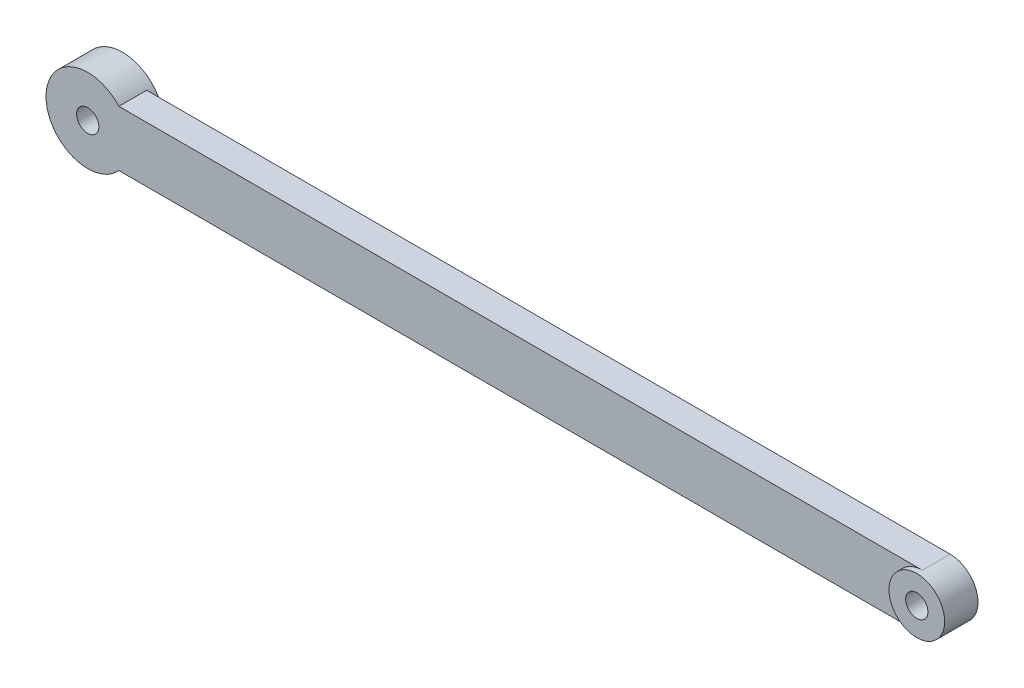
ISO-10303-21;
HEADER;
FILE_DESCRIPTION(('STEP AP214'),'2;1');
FILE_NAME('part.step','',(''),(''),'','','');
FILE_SCHEMA(('AUTOMOTIVE_DESIGN { 1 0 10303 214 1 1 1 1 }'));
ENDSEC;
DATA;
#1=APPLICATION_CONTEXT('core data for automotive mechanical design processes');
#2=APPLICATION_PROTOCOL_DEFINITION('international standard','automotive_design',2000,#1);
#3=PRODUCT_CONTEXT('',#1,'mechanical');
#4=PRODUCT('Part','Part','',(#3));
#5=PRODUCT_RELATED_PRODUCT_CATEGORY('part','',(#4));
#6=PRODUCT_DEFINITION_FORMATION('','',#4);
#7=PRODUCT_DEFINITION_CONTEXT('part definition',#1,'design');
#8=PRODUCT_DEFINITION('design','',#6,#7);
#9=PRODUCT_DEFINITION_SHAPE('','',#8);
#10=(LENGTH_UNIT() NAMED_UNIT(*) SI_UNIT(.MILLI.,.METRE.));
#11=(NAMED_UNIT(*) PLANE_ANGLE_UNIT() SI_UNIT($,.RADIAN.));
#12=(NAMED_UNIT(*) SI_UNIT($,.STERADIAN.) SOLID_ANGLE_UNIT());
#13=UNCERTAINTY_MEASURE_WITH_UNIT(LENGTH_MEASURE(1.E-05),#10,'distance_accuracy_value','');
#14=(GEOMETRIC_REPRESENTATION_CONTEXT(3) GLOBAL_UNCERTAINTY_ASSIGNED_CONTEXT((#13)) GLOBAL_UNIT_ASSIGNED_CONTEXT((#10,
#11,#12)) REPRESENTATION_CONTEXT('',''));
#15=CARTESIAN_POINT('',(0.,0.,0.));
#16=DIRECTION('',(0.,0.,1.));
#17=DIRECTION('',(1.,0.,0.));
#18=AXIS2_PLACEMENT_3D('',#15,#16,#17);
#19=CARTESIAN_POINT('',(0.,0.,0.));
#20=DIRECTION('',(0.,0.,1.));
#21=DIRECTION('',(1.,0.,0.));
#22=AXIS2_PLACEMENT_3D('',#19,#20,#21);
#23=PLANE('',#22);
#24=CARTESIAN_POINT('',(300.,0.,0.));
#25=DIRECTION('',(0.,0.,-1.));
#26=DIRECTION('',(-1.,0.,0.));
#27=AXIS2_PLACEMENT_3D('',#24,#25,#26);
#28=CIRCLE('',#27,3.99999999999999);
#29=CARTESIAN_POINT('',(296.,0.,0.));
#30=VERTEX_POINT('',#29);
#31=EDGE_CURVE('E117',#30,#30,#28,.T.);
#32=ORIENTED_EDGE('',*,*,#31,.F.);
#33=EDGE_LOOP('',(#32));
#34=FACE_BOUND('',#33,.T.);
#35=CARTESIAN_POINT('',(0.,0.,0.));
#36=DIRECTION('',(0.,0.,-1.));
#37=DIRECTION('',(-1.,0.,0.));
#38=AXIS2_PLACEMENT_3D('',#35,#36,#37);
#39=CIRCLE('',#38,15.);
#40=CARTESIAN_POINT('',(11.1803398874989,10.,0.));
#41=VERTEX_POINT('',#40);
#42=CARTESIAN_POINT('',(11.1803398874989,-10.,0.));
#43=VERTEX_POINT('',#42);
#44=EDGE_CURVE('E109',#41,#43,#39,.T.);
#45=ORIENTED_EDGE('',*,*,#44,.F.);
#46=DIRECTION('',(1.,0.,0.));
#47=VECTOR('',#46,1.);
#48=CARTESIAN_POINT('',(0.,10.,0.));
#49=LINE('',#48,#47);
#50=CARTESIAN_POINT('',(300.,10.,0.));
#51=VERTEX_POINT('',#50);
#52=EDGE_CURVE('E121',#41,#51,#49,.T.);
#53=ORIENTED_EDGE('',*,*,#52,.T.);
#54=CARTESIAN_POINT('',(300.,0.,0.));
#55=DIRECTION('',(0.,0.,1.));
#56=DIRECTION('',(1.,0.,0.));
#57=AXIS2_PLACEMENT_3D('',#54,#55,#56);
#58=CIRCLE('',#57,10.);
#59=CARTESIAN_POINT('',(300.,-10.,0.));
#60=VERTEX_POINT('',#59);
#61=EDGE_CURVE('E11',#60,#51,#58,.T.);
#62=ORIENTED_EDGE('',*,*,#61,.F.);
#63=DIRECTION('',(-1.,0.,0.));
#64=VECTOR('',#63,1.);
#65=CARTESIAN_POINT('',(0.,-10.,0.));
#66=LINE('',#65,#64);
#67=EDGE_CURVE('E92',#60,#43,#66,.T.);
#68=ORIENTED_EDGE('',*,*,#67,.T.);
#69=EDGE_LOOP('',(#45,#53,#62,#68));
#70=FACE_BOUND('',#69,.T.);
#71=ADVANCED_FACE('F41',(#34,#70),#23,.F.);
#72=CARTESIAN_POINT('',(300.,0.,10.));
#73=DIRECTION('',(0.,0.,-1.));
#74=DIRECTION('',(-1.,0.,0.));
#75=AXIS2_PLACEMENT_3D('',#72,#73,#74);
#76=CYLINDRICAL_SURFACE('',#75,10.);
#77=DIRECTION('',(0.,0.,-1.));
#78=VECTOR('',#77,1.);
#79=CARTESIAN_POINT('',(300.,10.,10.));
#80=LINE('',#79,#78);
#81=CARTESIAN_POINT('',(300.,10.,10.));
#82=VERTEX_POINT('',#81);
#83=EDGE_CURVE('E49',#82,#51,#80,.T.);
#84=ORIENTED_EDGE('',*,*,#83,.F.);
#85=CARTESIAN_POINT('',(300.,0.,10.));
#86=DIRECTION('',(0.,0.,1.));
#87=DIRECTION('',(1.,0.,0.));
#88=AXIS2_PLACEMENT_3D('',#85,#86,#87);
#89=CIRCLE('',#88,10.);
#90=CARTESIAN_POINT('',(300.,-10.,10.));
#91=VERTEX_POINT('',#90);
#92=EDGE_CURVE('E96',#82,#91,#89,.T.);
#93=ORIENTED_EDGE('',*,*,#92,.T.);
#94=DIRECTION('',(0.,0.,-1.));
#95=VECTOR('',#94,1.);
#96=CARTESIAN_POINT('',(300.,-10.,10.));
#97=LINE('',#96,#95);
#98=EDGE_CURVE('E56',#91,#60,#97,.T.);
#99=ORIENTED_EDGE('',*,*,#98,.T.);
#100=ORIENTED_EDGE('',*,*,#61,.T.);
#101=EDGE_LOOP('',(#84,#93,#99,#100));
#102=FACE_BOUND('',#101,.T.);
#103=CARTESIAN_POINT('',(300.,0.,12.));
#104=DIRECTION('',(0.,0.,1.));
#105=DIRECTION('',(1.,0.,0.));
#106=AXIS2_PLACEMENT_3D('',#103,#104,#105);
#107=CIRCLE('',#106,10.);
#108=CARTESIAN_POINT('',(310.,0.,12.));
#109=VERTEX_POINT('',#108);
#110=EDGE_CURVE('E102',#109,#109,#107,.T.);
#111=ORIENTED_EDGE('',*,*,#110,.F.);
#112=EDGE_LOOP('',(#111));
#113=FACE_BOUND('',#112,.T.);
#114=ADVANCED_FACE('F43',(#102,#113),#76,.T.);
#115=CARTESIAN_POINT('',(0.,0.,10.));
#116=DIRECTION('',(0.,0.,1.));
#117=DIRECTION('',(1.,0.,0.));
#118=AXIS2_PLACEMENT_3D('',#115,#116,#117);
#119=PLANE('',#118);
#120=ORIENTED_EDGE('',*,*,#92,.F.);
#121=DIRECTION('',(1.,0.,0.));
#122=VECTOR('',#121,1.);
#123=CARTESIAN_POINT('',(0.,10.,10.));
#124=LINE('',#123,#122);
#125=CARTESIAN_POINT('',(11.1803398874989,10.,10.));
#126=VERTEX_POINT('',#125);
#127=EDGE_CURVE('E82',#126,#82,#124,.T.);
#128=ORIENTED_EDGE('',*,*,#127,.F.);
#129=CARTESIAN_POINT('',(0.,0.,10.));
#130=DIRECTION('',(0.,0.,1.));
#131=DIRECTION('',(1.,0.,0.));
#132=AXIS2_PLACEMENT_3D('',#129,#130,#131);
#133=CIRCLE('',#132,15.);
#134=CARTESIAN_POINT('',(11.1803398874989,-10.,10.));
#135=VERTEX_POINT('',#134);
#136=EDGE_CURVE('E120',#126,#135,#133,.T.);
#137=ORIENTED_EDGE('',*,*,#136,.T.);
#138=DIRECTION('',(-1.,0.,0.));
#139=VECTOR('',#138,1.);
#140=CARTESIAN_POINT('',(0.,-10.,10.));
#141=LINE('',#140,#139);
#142=EDGE_CURVE('E91',#91,#135,#141,.T.);
#143=ORIENTED_EDGE('',*,*,#142,.F.);
#144=EDGE_LOOP('',(#120,#128,#137,#143));
#145=FACE_BOUND('',#144,.T.);
#146=CARTESIAN_POINT('',(0.,0.,10.));
#147=DIRECTION('',(0.,0.,1.));
#148=DIRECTION('',(1.,0.,0.));
#149=AXIS2_PLACEMENT_3D('',#146,#147,#148);
#150=CIRCLE('',#149,4.);
#151=CARTESIAN_POINT('',(4.,0.,10.));
#152=VERTEX_POINT('',#151);
#153=EDGE_CURVE('E113',#152,#152,#150,.T.);
#154=ORIENTED_EDGE('',*,*,#153,.F.);
#155=EDGE_LOOP('',(#154));
#156=FACE_BOUND('',#155,.T.);
#157=ADVANCED_FACE('F97',(#145,#156),#119,.T.);
#158=CARTESIAN_POINT('',(0.,10.,10.));
#159=DIRECTION('',(0.,1.,0.));
#160=DIRECTION('',(0.,0.,1.));
#161=AXIS2_PLACEMENT_3D('',#158,#159,#160);
#162=PLANE('',#161);
#163=ORIENTED_EDGE('',*,*,#52,.F.);
#164=DIRECTION('',(0.,0.,-1.));
#165=VECTOR('',#164,1.);
#166=CARTESIAN_POINT('',(11.1803398874989,10.,10.));
#167=LINE('',#166,#165);
#168=EDGE_CURVE('E87',#126,#41,#167,.T.);
#169=ORIENTED_EDGE('',*,*,#168,.F.);
#170=ORIENTED_EDGE('',*,*,#127,.T.);
#171=ORIENTED_EDGE('',*,*,#83,.T.);
#172=EDGE_LOOP('',(#163,#169,#170,#171));
#173=FACE_BOUND('',#172,.T.);
#174=ADVANCED_FACE('F84',(#173),#162,.T.);
#175=CARTESIAN_POINT('',(0.,-10.,10.));
#176=DIRECTION('',(0.,-1.,0.));
#177=DIRECTION('',(1.,0.,0.));
#178=AXIS2_PLACEMENT_3D('',#175,#176,#177);
#179=PLANE('',#178);
#180=ORIENTED_EDGE('',*,*,#67,.F.);
#181=ORIENTED_EDGE('',*,*,#98,.F.);
#182=ORIENTED_EDGE('',*,*,#142,.T.);
#183=DIRECTION('',(0.,0.,-1.));
#184=VECTOR('',#183,1.);
#185=CARTESIAN_POINT('',(11.1803398874989,-10.,10.));
#186=LINE('',#185,#184);
#187=EDGE_CURVE('E128',#135,#43,#186,.T.);
#188=ORIENTED_EDGE('',*,*,#187,.T.);
#189=EDGE_LOOP('',(#180,#181,#182,#188));
#190=FACE_BOUND('',#189,.T.);
#191=ADVANCED_FACE('F135',(#190),#179,.T.);
#192=CARTESIAN_POINT('',(0.,0.,10.));
#193=DIRECTION('',(0.,0.,-1.));
#194=DIRECTION('',(-1.,0.,0.));
#195=AXIS2_PLACEMENT_3D('',#192,#193,#194);
#196=CYLINDRICAL_SURFACE('',#195,15.);
#197=ORIENTED_EDGE('',*,*,#168,.T.);
#198=ORIENTED_EDGE('',*,*,#44,.T.);
#199=ORIENTED_EDGE('',*,*,#187,.F.);
#200=ORIENTED_EDGE('',*,*,#136,.F.);
#201=EDGE_LOOP('',(#197,#198,#199,#200));
#202=FACE_BOUND('',#201,.T.);
#203=CARTESIAN_POINT('',(0.,0.,-2.5));
#204=DIRECTION('',(0.,0.,-1.));
#205=DIRECTION('',(-1.,0.,0.));
#206=AXIS2_PLACEMENT_3D('',#203,#204,#205);
#207=CIRCLE('',#206,15.);
#208=CARTESIAN_POINT('',(-15.,0.,-2.5));
#209=VERTEX_POINT('',#208);
#210=EDGE_CURVE('E110',#209,#209,#207,.T.);
#211=ORIENTED_EDGE('',*,*,#210,.F.);
#212=EDGE_LOOP('',(#211));
#213=FACE_BOUND('',#212,.T.);
#214=ADVANCED_FACE('F132',(#202,#213),#196,.T.);
#215=CARTESIAN_POINT('',(300.,0.,20.));
#216=DIRECTION('',(0.,0.,-1.));
#217=DIRECTION('',(-1.,0.,0.));
#218=AXIS2_PLACEMENT_3D('',#215,#216,#217);
#219=CYLINDRICAL_SURFACE('',#218,3.99999999999999);
#220=ORIENTED_EDGE('',*,*,#31,.T.);
#221=EDGE_LOOP('',(#220));
#222=FACE_BOUND('',#221,.T.);
#223=CARTESIAN_POINT('',(300.,0.,12.));
#224=DIRECTION('',(0.,0.,1.));
#225=DIRECTION('',(1.,0.,0.));
#226=AXIS2_PLACEMENT_3D('',#223,#224,#225);
#227=CIRCLE('',#226,3.99999999999999);
#228=CARTESIAN_POINT('',(304.,0.,12.));
#229=VERTEX_POINT('',#228);
#230=EDGE_CURVE('E99',#229,#229,#227,.F.);
#231=ORIENTED_EDGE('',*,*,#230,.F.);
#232=EDGE_LOOP('',(#231));
#233=FACE_BOUND('',#232,.T.);
#234=ADVANCED_FACE('F142',(#222,#233),#219,.F.);
#235=CARTESIAN_POINT('',(0.,0.,20.));
#236=DIRECTION('',(0.,0.,-1.));
#237=DIRECTION('',(-1.,0.,0.));
#238=AXIS2_PLACEMENT_3D('',#235,#236,#237);
#239=CYLINDRICAL_SURFACE('',#238,4.);
#240=ORIENTED_EDGE('',*,*,#153,.T.);
#241=EDGE_LOOP('',(#240));
#242=FACE_BOUND('',#241,.T.);
#243=CARTESIAN_POINT('',(0.,0.,-2.5));
#244=DIRECTION('',(0.,0.,-1.));
#245=DIRECTION('',(-1.,0.,0.));
#246=AXIS2_PLACEMENT_3D('',#243,#244,#245);
#247=CIRCLE('',#246,4.);
#248=CARTESIAN_POINT('',(-4.,0.,-2.5));
#249=VERTEX_POINT('',#248);
#250=EDGE_CURVE('E106',#249,#249,#247,.T.);
#251=ORIENTED_EDGE('',*,*,#250,.T.);
#252=EDGE_LOOP('',(#251));
#253=FACE_BOUND('',#252,.T.);
#254=ADVANCED_FACE('F178',(#242,#253),#239,.F.);
#255=CARTESIAN_POINT('',(0.,0.,-2.5));
#256=DIRECTION('',(0.,0.,-1.));
#257=DIRECTION('',(-1.,0.,0.));
#258=AXIS2_PLACEMENT_3D('',#255,#256,#257);
#259=PLANE('',#258);
#260=ORIENTED_EDGE('',*,*,#210,.T.);
#261=EDGE_LOOP('',(#260));
#262=FACE_BOUND('',#261,.T.);
#263=ORIENTED_EDGE('',*,*,#250,.F.);
#264=EDGE_LOOP('',(#263));
#265=FACE_BOUND('',#264,.T.);
#266=ADVANCED_FACE('F182',(#262,#265),#259,.T.);
#267=CARTESIAN_POINT('',(0.,0.,12.));
#268=DIRECTION('',(0.,0.,1.));
#269=DIRECTION('',(1.,0.,0.));
#270=AXIS2_PLACEMENT_3D('',#267,#268,#269);
#271=PLANE('',#270);
#272=ORIENTED_EDGE('',*,*,#230,.T.);
#273=EDGE_LOOP('',(#272));
#274=FACE_BOUND('',#273,.T.);
#275=ORIENTED_EDGE('',*,*,#110,.T.);
#276=EDGE_LOOP('',(#275));
#277=FACE_BOUND('',#276,.T.);
#278=ADVANCED_FACE('F192',(#274,#277),#271,.T.);
#279=CLOSED_SHELL('',(#71,#114,#157,#174,#191,#214,#234,#254,#266,#278));
#280=MANIFOLD_SOLID_BREP('B2',#279);
#281=ADVANCED_BREP_SHAPE_REPRESENTATION('',(#18,#280),#14);
#282=SHAPE_DEFINITION_REPRESENTATION(#9,#281);
ENDSEC;
END-ISO-10303-21;
